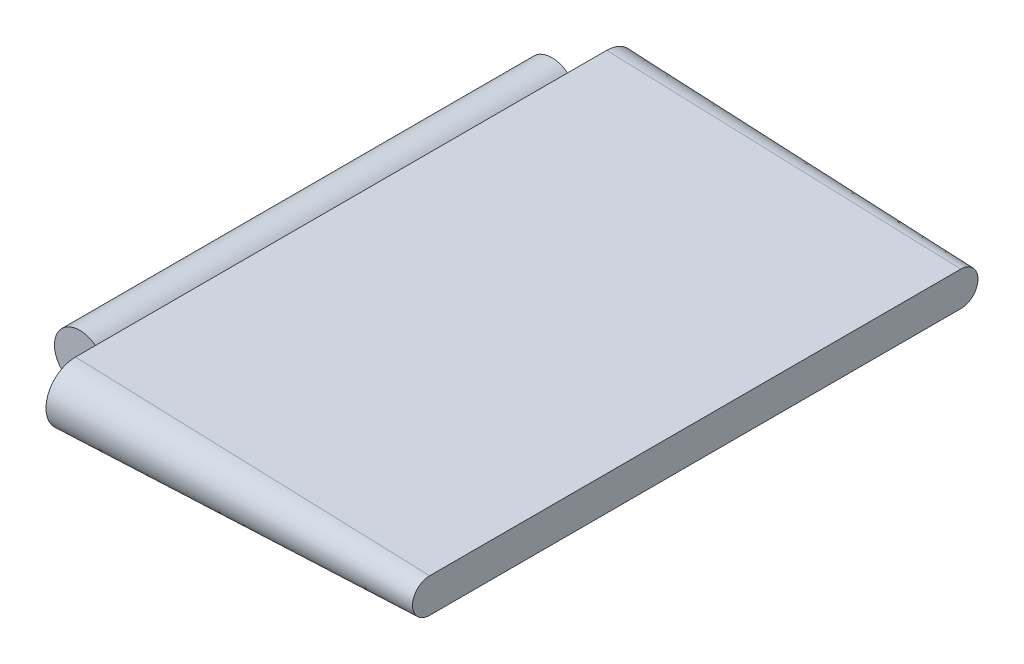
ISO-10303-21;
HEADER;
FILE_DESCRIPTION(('STEP AP214'),'2;1');
FILE_NAME('part.step','',(''),(''),'','','');
FILE_SCHEMA(('AUTOMOTIVE_DESIGN { 1 0 10303 214 1 1 1 1 }'));
ENDSEC;
DATA;
#1=APPLICATION_CONTEXT('core data for automotive mechanical design processes');
#2=APPLICATION_PROTOCOL_DEFINITION('international standard','automotive_design',2000,#1);
#3=PRODUCT_CONTEXT('',#1,'mechanical');
#4=PRODUCT('Part','Part','',(#3));
#5=PRODUCT_RELATED_PRODUCT_CATEGORY('part','',(#4));
#6=PRODUCT_DEFINITION_FORMATION('','',#4);
#7=PRODUCT_DEFINITION_CONTEXT('part definition',#1,'design');
#8=PRODUCT_DEFINITION('design','',#6,#7);
#9=PRODUCT_DEFINITION_SHAPE('','',#8);
#10=(LENGTH_UNIT() NAMED_UNIT(*) SI_UNIT(.MILLI.,.METRE.));
#11=(NAMED_UNIT(*) PLANE_ANGLE_UNIT() SI_UNIT($,.RADIAN.));
#12=(NAMED_UNIT(*) SI_UNIT($,.STERADIAN.) SOLID_ANGLE_UNIT());
#13=UNCERTAINTY_MEASURE_WITH_UNIT(LENGTH_MEASURE(1.E-05),#10,'distance_accuracy_value','');
#14=(GEOMETRIC_REPRESENTATION_CONTEXT(3) GLOBAL_UNCERTAINTY_ASSIGNED_CONTEXT((#13)) GLOBAL_UNIT_ASSIGNED_CONTEXT((#10,
#11,#12)) REPRESENTATION_CONTEXT('',''));
#15=CARTESIAN_POINT('',(0.,0.,0.));
#16=DIRECTION('',(0.,0.,1.));
#17=DIRECTION('',(1.,0.,0.));
#18=AXIS2_PLACEMENT_3D('',#15,#16,#17);
#19=CARTESIAN_POINT('',(-10.7132788485526,0.,-100.));
#20=DIRECTION('',(0.,0.,1.));
#21=DIRECTION('',(1.,0.,0.));
#22=AXIS2_PLACEMENT_3D('',#19,#20,#21);
#23=CYLINDRICAL_SURFACE('',#22,10.7132788485526);
#24=CARTESIAN_POINT('',(-10.7132788485526,0.,-100.));
#25=DIRECTION('',(0.,0.,1.));
#26=DIRECTION('',(1.,0.,0.));
#27=AXIS2_PLACEMENT_3D('',#24,#25,#26);
#28=CIRCLE('',#27,10.7132788485526);
#29=CARTESIAN_POINT('',(0.,0.,-100.));
#30=VERTEX_POINT('',#29);
#31=EDGE_CURVE('E11',#30,#30,#28,.T.);
#32=ORIENTED_EDGE('',*,*,#31,.T.);
#33=EDGE_LOOP('',(#32));
#34=FACE_BOUND('',#33,.T.);
#35=CARTESIAN_POINT('',(-10.7132788485526,0.,100.));
#36=DIRECTION('',(0.,0.,1.));
#37=DIRECTION('',(1.,0.,0.));
#38=AXIS2_PLACEMENT_3D('',#35,#36,#37);
#39=CIRCLE('',#38,10.7132788485526);
#40=CARTESIAN_POINT('',(0.,0.,100.));
#41=VERTEX_POINT('',#40);
#42=EDGE_CURVE('E52',#41,#41,#39,.T.);
#43=ORIENTED_EDGE('',*,*,#42,.F.);
#44=EDGE_LOOP('',(#43));
#45=FACE_BOUND('',#44,.T.);
#46=ADVANCED_FACE('F46',(#34,#45),#23,.T.);
#47=CARTESIAN_POINT('',(-10.7132788485526,0.,-100.));
#48=DIRECTION('',(0.,0.,1.));
#49=DIRECTION('',(1.,0.,0.));
#50=AXIS2_PLACEMENT_3D('',#47,#48,#49);
#51=PLANE('',#50);
#52=ORIENTED_EDGE('',*,*,#31,.F.);
#53=EDGE_LOOP('',(#52));
#54=FACE_BOUND('',#53,.T.);
#55=ADVANCED_FACE('F61',(#54),#51,.F.);
#56=CARTESIAN_POINT('',(-10.7132788485526,0.,100.));
#57=DIRECTION('',(0.,0.,1.));
#58=DIRECTION('',(1.,0.,0.));
#59=AXIS2_PLACEMENT_3D('',#56,#57,#58);
#60=PLANE('',#59);
#61=ORIENTED_EDGE('',*,*,#42,.T.);
#62=EDGE_LOOP('',(#61));
#63=FACE_BOUND('',#62,.T.);
#64=ADVANCED_FACE('F58',(#63),#60,.T.);
#65=CLOSED_SHELL('',(#46,#55,#64));
#66=MANIFOLD_SOLID_BREP('B2',#65);
#67=CARTESIAN_POINT('',(0.,0.,112.5));
#68=DIRECTION('',(-1.,0.,0.));
#69=DIRECTION('',(0.,0.,-1.));
#70=AXIS2_PLACEMENT_3D('',#67,#68,#69);
#71=CONICAL_SURFACE('',#70,12.5,0.0349065850398867);
#72=CARTESIAN_POINT('',(0.,0.,112.5));
#73=DIRECTION('',(1.,0.,0.));
#74=DIRECTION('',(0.,0.,-1.));
#75=AXIS2_PLACEMENT_3D('',#72,#73,#74);
#76=CIRCLE('',#75,12.5);
#77=CARTESIAN_POINT('',(0.,12.5,112.5));
#78=VERTEX_POINT('',#77);
#79=CARTESIAN_POINT('',(0.,-12.5,112.5));
#80=VERTEX_POINT('',#79);
#81=EDGE_CURVE('E141',#78,#80,#76,.T.);
#82=ORIENTED_EDGE('',*,*,#81,.T.);
#83=DIRECTION('',(-0.999390827019096,-0.034899496702501,0.));
#84=VECTOR('',#83,1.);
#85=CARTESIAN_POINT('',(0.,-12.5,112.5));
#86=LINE('',#85,#84);
#87=CARTESIAN_POINT('',(150.,-7.26188457623784,112.5));
#88=VERTEX_POINT('',#87);
#89=EDGE_CURVE('E44',#88,#80,#86,.T.);
#90=ORIENTED_EDGE('',*,*,#89,.F.);
#91=CARTESIAN_POINT('',(150.,0.,112.5));
#92=DIRECTION('',(1.,0.,0.));
#93=DIRECTION('',(0.,0.,-1.));
#94=AXIS2_PLACEMENT_3D('',#91,#92,#93);
#95=CIRCLE('',#94,7.26188457623783);
#96=CARTESIAN_POINT('',(150.,7.26188457623782,112.5));
#97=VERTEX_POINT('',#96);
#98=EDGE_CURVE('E156',#97,#88,#95,.T.);
#99=ORIENTED_EDGE('',*,*,#98,.F.);
#100=DIRECTION('',(-0.999390827019096,0.034899496702501,0.));
#101=VECTOR('',#100,1.);
#102=CARTESIAN_POINT('',(0.,12.5,112.5));
#103=LINE('',#102,#101);
#104=EDGE_CURVE('E109',#97,#78,#103,.T.);
#105=ORIENTED_EDGE('',*,*,#104,.T.);
#106=EDGE_LOOP('',(#82,#90,#99,#105));
#107=FACE_BOUND('',#106,.T.);
#108=ADVANCED_FACE('F92',(#107),#71,.T.);
#109=CARTESIAN_POINT('',(0.,-12.5,112.5));
#110=DIRECTION('',(0.034899496702501,-0.999390827019096,0.));
#111=DIRECTION('',(0.999390827019096,0.034899496702501,0.));
#112=AXIS2_PLACEMENT_3D('',#109,#110,#111);
#113=PLANE('',#112);
#114=DIRECTION('',(0.,0.,-1.));
#115=VECTOR('',#114,1.);
#116=CARTESIAN_POINT('',(0.,-12.5,112.5));
#117=LINE('',#116,#115);
#118=CARTESIAN_POINT('',(0.,-12.5,-112.5));
#119=VERTEX_POINT('',#118);
#120=EDGE_CURVE('E137',#80,#119,#117,.T.);
#121=ORIENTED_EDGE('',*,*,#120,.T.);
#122=DIRECTION('',(-0.999390827019096,-0.034899496702501,0.));
#123=VECTOR('',#122,1.);
#124=CARTESIAN_POINT('',(0.,-12.5,-112.5));
#125=LINE('',#124,#123);
#126=CARTESIAN_POINT('',(150.,-7.26188457623784,-112.5));
#127=VERTEX_POINT('',#126);
#128=EDGE_CURVE('E101',#127,#119,#125,.T.);
#129=ORIENTED_EDGE('',*,*,#128,.F.);
#130=DIRECTION('',(0.,0.,1.));
#131=VECTOR('',#130,1.);
#132=CARTESIAN_POINT('',(150.,-7.26188457623784,112.5));
#133=LINE('',#132,#131);
#134=EDGE_CURVE('E149',#88,#127,#133,.F.);
#135=ORIENTED_EDGE('',*,*,#134,.F.);
#136=ORIENTED_EDGE('',*,*,#89,.T.);
#137=EDGE_LOOP('',(#121,#129,#135,#136));
#138=FACE_BOUND('',#137,.T.);
#139=ADVANCED_FACE('F94',(#138),#113,.T.);
#140=CARTESIAN_POINT('',(0.,0.,-112.5));
#141=DIRECTION('',(-1.,0.,0.));
#142=DIRECTION('',(0.,0.,-1.));
#143=AXIS2_PLACEMENT_3D('',#140,#141,#142);
#144=CONICAL_SURFACE('',#143,12.5,0.0349065850398867);
#145=CARTESIAN_POINT('',(0.,0.,-112.5));
#146=DIRECTION('',(1.,0.,0.));
#147=DIRECTION('',(0.,0.,-1.));
#148=AXIS2_PLACEMENT_3D('',#145,#146,#147);
#149=CIRCLE('',#148,12.5);
#150=CARTESIAN_POINT('',(0.,12.5,-112.5));
#151=VERTEX_POINT('',#150);
#152=EDGE_CURVE('E143',#119,#151,#149,.T.);
#153=ORIENTED_EDGE('',*,*,#152,.T.);
#154=DIRECTION('',(-0.999390827019096,0.034899496702501,0.));
#155=VECTOR('',#154,1.);
#156=CARTESIAN_POINT('',(0.,12.5,-112.5));
#157=LINE('',#156,#155);
#158=CARTESIAN_POINT('',(150.,7.26188457623782,-112.5));
#159=VERTEX_POINT('',#158);
#160=EDGE_CURVE('E159',#159,#151,#157,.T.);
#161=ORIENTED_EDGE('',*,*,#160,.F.);
#162=CARTESIAN_POINT('',(150.,0.,-112.5));
#163=DIRECTION('',(1.,0.,0.));
#164=DIRECTION('',(0.,0.,-1.));
#165=AXIS2_PLACEMENT_3D('',#162,#163,#164);
#166=CIRCLE('',#165,7.26188457623783);
#167=EDGE_CURVE('E117',#127,#159,#166,.T.);
#168=ORIENTED_EDGE('',*,*,#167,.F.);
#169=ORIENTED_EDGE('',*,*,#128,.T.);
#170=EDGE_LOOP('',(#153,#161,#168,#169));
#171=FACE_BOUND('',#170,.T.);
#172=ADVANCED_FACE('F166',(#171),#144,.T.);
#173=CARTESIAN_POINT('',(0.,12.5,112.5));
#174=DIRECTION('',(0.034899496702501,0.999390827019096,0.));
#175=DIRECTION('',(-0.999390827019096,0.034899496702501,0.));
#176=AXIS2_PLACEMENT_3D('',#173,#174,#175);
#177=PLANE('',#176);
#178=DIRECTION('',(0.,0.,-1.));
#179=VECTOR('',#178,1.);
#180=CARTESIAN_POINT('',(0.,12.5,112.5));
#181=LINE('',#180,#179);
#182=EDGE_CURVE('E155',#78,#151,#181,.T.);
#183=ORIENTED_EDGE('',*,*,#182,.F.);
#184=ORIENTED_EDGE('',*,*,#104,.F.);
#185=DIRECTION('',(0.,0.,-1.));
#186=VECTOR('',#185,1.);
#187=CARTESIAN_POINT('',(150.,7.26188457623782,112.5));
#188=LINE('',#187,#186);
#189=EDGE_CURVE('E96',#97,#159,#188,.T.);
#190=ORIENTED_EDGE('',*,*,#189,.T.);
#191=ORIENTED_EDGE('',*,*,#160,.T.);
#192=EDGE_LOOP('',(#183,#184,#190,#191));
#193=FACE_BOUND('',#192,.T.);
#194=ADVANCED_FACE('F163',(#193),#177,.T.);
#195=CARTESIAN_POINT('',(150.,0.,112.5));
#196=DIRECTION('',(1.,0.,0.));
#197=DIRECTION('',(0.,0.,-1.));
#198=AXIS2_PLACEMENT_3D('',#195,#196,#197);
#199=PLANE('',#198);
#200=ORIENTED_EDGE('',*,*,#98,.T.);
#201=ORIENTED_EDGE('',*,*,#134,.T.);
#202=ORIENTED_EDGE('',*,*,#167,.T.);
#203=ORIENTED_EDGE('',*,*,#189,.F.);
#204=EDGE_LOOP('',(#200,#201,#202,#203));
#205=FACE_BOUND('',#204,.T.);
#206=ADVANCED_FACE('F164',(#205),#199,.T.);
#207=CARTESIAN_POINT('',(0.,0.,112.5));
#208=DIRECTION('',(1.,0.,0.));
#209=DIRECTION('',(0.,0.,-1.));
#210=AXIS2_PLACEMENT_3D('',#207,#208,#209);
#211=PLANE('',#210);
#212=ORIENTED_EDGE('',*,*,#81,.F.);
#213=ORIENTED_EDGE('',*,*,#182,.T.);
#214=ORIENTED_EDGE('',*,*,#152,.F.);
#215=ORIENTED_EDGE('',*,*,#120,.F.);
#216=EDGE_LOOP('',(#212,#213,#214,#215));
#217=FACE_BOUND('',#216,.T.);
#218=ADVANCED_FACE('F138',(#217),#211,.F.);
#219=CLOSED_SHELL('',(#108,#139,#172,#194,#206,#218));
#220=MANIFOLD_SOLID_BREP('B6',#219);
#221=ADVANCED_BREP_SHAPE_REPRESENTATION('',(#18,#66,#220),#14);
#222=SHAPE_DEFINITION_REPRESENTATION(#9,#221);
ENDSEC;
END-ISO-10303-21;
